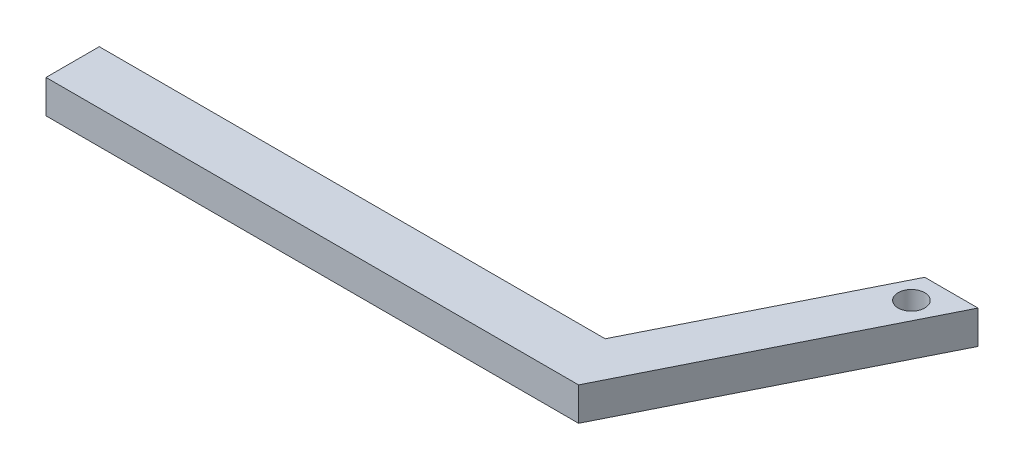
ISO-10303-21;
HEADER;
FILE_DESCRIPTION(('STEP AP214'),'2;1');
FILE_NAME('part.step','',(''),(''),'','','');
FILE_SCHEMA(('AUTOMOTIVE_DESIGN { 1 0 10303 214 1 1 1 1 }'));
ENDSEC;
DATA;
#1=APPLICATION_CONTEXT('core data for automotive mechanical design processes');
#2=APPLICATION_PROTOCOL_DEFINITION('international standard','automotive_design',2000,#1);
#3=PRODUCT_CONTEXT('',#1,'mechanical');
#4=PRODUCT('Part','Part','',(#3));
#5=PRODUCT_RELATED_PRODUCT_CATEGORY('part','',(#4));
#6=PRODUCT_DEFINITION_FORMATION('','',#4);
#7=PRODUCT_DEFINITION_CONTEXT('part definition',#1,'design');
#8=PRODUCT_DEFINITION('design','',#6,#7);
#9=PRODUCT_DEFINITION_SHAPE('','',#8);
#10=(LENGTH_UNIT() NAMED_UNIT(*) SI_UNIT(.MILLI.,.METRE.));
#11=(NAMED_UNIT(*) PLANE_ANGLE_UNIT() SI_UNIT($,.RADIAN.));
#12=(NAMED_UNIT(*) SI_UNIT($,.STERADIAN.) SOLID_ANGLE_UNIT());
#13=UNCERTAINTY_MEASURE_WITH_UNIT(LENGTH_MEASURE(1.E-05),#10,'distance_accuracy_value','');
#14=(GEOMETRIC_REPRESENTATION_CONTEXT(3) GLOBAL_UNCERTAINTY_ASSIGNED_CONTEXT((#13)) GLOBAL_UNIT_ASSIGNED_CONTEXT((#10,
#11,#12)) REPRESENTATION_CONTEXT('',''));
#15=CARTESIAN_POINT('',(0.,0.,0.));
#16=DIRECTION('',(0.,0.,1.));
#17=DIRECTION('',(1.,0.,0.));
#18=AXIS2_PLACEMENT_3D('',#15,#16,#17);
#19=CARTESIAN_POINT('',(-25.4,-1.5875,5.08));
#20=DIRECTION('',(1.,0.,0.));
#21=DIRECTION('',(0.,1.,0.));
#22=AXIS2_PLACEMENT_3D('',#19,#20,#21);
#23=PLANE('',#22);
#24=DIRECTION('',(0.,-1.,0.));
#25=VECTOR('',#24,1.);
#26=CARTESIAN_POINT('',(-25.4,-1.5875,0.));
#27=LINE('',#26,#25);
#28=CARTESIAN_POINT('',(-25.4,1.5875,0.));
#29=VERTEX_POINT('',#28);
#30=CARTESIAN_POINT('',(-25.4,-1.5875,0.));
#31=VERTEX_POINT('',#30);
#32=EDGE_CURVE('E81',#29,#31,#27,.T.);
#33=ORIENTED_EDGE('',*,*,#32,.T.);
#34=DIRECTION('',(0.,0.,-1.));
#35=VECTOR('',#34,1.);
#36=CARTESIAN_POINT('',(-25.4,-1.5875,5.08));
#37=LINE('',#36,#35);
#38=CARTESIAN_POINT('',(-25.4,-1.5875,5.08));
#39=VERTEX_POINT('',#38);
#40=EDGE_CURVE('E40',#39,#31,#37,.T.);
#41=ORIENTED_EDGE('',*,*,#40,.F.);
#42=DIRECTION('',(0.,-1.,0.));
#43=VECTOR('',#42,1.);
#44=CARTESIAN_POINT('',(-25.4,-1.5875,5.08));
#45=LINE('',#44,#43);
#46=CARTESIAN_POINT('',(-25.4,1.5875,5.08));
#47=VERTEX_POINT('',#46);
#48=EDGE_CURVE('E75',#47,#39,#45,.T.);
#49=ORIENTED_EDGE('',*,*,#48,.F.);
#50=DIRECTION('',(0.,0.,-1.));
#51=VECTOR('',#50,1.);
#52=CARTESIAN_POINT('',(-25.4,1.5875,5.08));
#53=LINE('',#52,#51);
#54=EDGE_CURVE('E70',#47,#29,#53,.T.);
#55=ORIENTED_EDGE('',*,*,#54,.T.);
#56=EDGE_LOOP('',(#33,#41,#49,#55));
#57=FACE_BOUND('',#56,.T.);
#58=ADVANCED_FACE('F33',(#57),#23,.F.);
#59=CARTESIAN_POINT('',(-25.4,-1.5875,5.08));
#60=DIRECTION('',(0.,1.,0.));
#61=DIRECTION('',(-1.,0.,0.));
#62=AXIS2_PLACEMENT_3D('',#59,#60,#61);
#63=PLANE('',#62);
#64=DIRECTION('',(1.,0.,0.));
#65=VECTOR('',#64,1.);
#66=CARTESIAN_POINT('',(-25.4,-1.5875,0.));
#67=LINE('',#66,#65);
#68=CARTESIAN_POINT('',(22.86,-1.5875,0.));
#69=VERTEX_POINT('',#68);
#70=EDGE_CURVE('E76',#31,#69,#67,.T.);
#71=ORIENTED_EDGE('',*,*,#70,.T.);
#72=DIRECTION('',(0.447213595499958,0.,-0.894427190999916));
#73=VECTOR('',#72,1.);
#74=CARTESIAN_POINT('',(33.02,-1.5875,-20.32));
#75=LINE('',#74,#73);
#76=CARTESIAN_POINT('',(33.02,-1.5875,-20.32));
#77=VERTEX_POINT('',#76);
#78=EDGE_CURVE('E139',#69,#77,#75,.T.);
#79=ORIENTED_EDGE('',*,*,#78,.T.);
#80=DIRECTION('',(1.,0.,0.));
#81=VECTOR('',#80,1.);
#82=CARTESIAN_POINT('',(38.1,-1.5875,-20.32));
#83=LINE('',#82,#81);
#84=CARTESIAN_POINT('',(38.1,-1.5875,-20.32));
#85=VERTEX_POINT('',#84);
#86=EDGE_CURVE('E137',#77,#85,#83,.T.);
#87=ORIENTED_EDGE('',*,*,#86,.T.);
#88=DIRECTION('',(-0.447213595499958,0.,0.894427190999916));
#89=VECTOR('',#88,1.);
#90=CARTESIAN_POINT('',(25.4,-1.5875,5.08));
#91=LINE('',#90,#89);
#92=CARTESIAN_POINT('',(25.4,-1.5875,5.08));
#93=VERTEX_POINT('',#92);
#94=EDGE_CURVE('E103',#85,#93,#91,.T.);
#95=ORIENTED_EDGE('',*,*,#94,.T.);
#96=DIRECTION('',(1.,0.,0.));
#97=VECTOR('',#96,1.);
#98=CARTESIAN_POINT('',(-25.4,-1.5875,5.08));
#99=LINE('',#98,#97);
#100=EDGE_CURVE('E99',#39,#93,#99,.T.);
#101=ORIENTED_EDGE('',*,*,#100,.F.);
#102=ORIENTED_EDGE('',*,*,#40,.T.);
#103=EDGE_LOOP('',(#71,#79,#87,#95,#101,#102));
#104=FACE_BOUND('',#103,.T.);
#105=CARTESIAN_POINT('',(34.29,-1.5875,-17.78));
#106=DIRECTION('',(0.,-1.,0.));
#107=DIRECTION('',(1.,0.,0.));
#108=AXIS2_PLACEMENT_3D('',#105,#106,#107);
#109=CIRCLE('',#108,1.27);
#110=CARTESIAN_POINT('',(35.56,-1.5875,-17.78));
#111=VERTEX_POINT('',#110);
#112=EDGE_CURVE('E141',#111,#111,#109,.T.);
#113=ORIENTED_EDGE('',*,*,#112,.F.);
#114=EDGE_LOOP('',(#113));
#115=FACE_BOUND('',#114,.T.);
#116=ADVANCED_FACE('F94',(#104,#115),#63,.F.);
#117=CARTESIAN_POINT('',(-25.4,1.5875,5.08));
#118=DIRECTION('',(0.,-1.,0.));
#119=DIRECTION('',(0.,0.,-1.));
#120=AXIS2_PLACEMENT_3D('',#117,#118,#119);
#121=PLANE('',#120);
#122=ORIENTED_EDGE('',*,*,#54,.F.);
#123=DIRECTION('',(-1.,0.,0.));
#124=VECTOR('',#123,1.);
#125=CARTESIAN_POINT('',(-25.4,1.5875,5.08));
#126=LINE('',#125,#124);
#127=CARTESIAN_POINT('',(25.4,1.5875,5.08));
#128=VERTEX_POINT('',#127);
#129=EDGE_CURVE('E55',#128,#47,#126,.T.);
#130=ORIENTED_EDGE('',*,*,#129,.F.);
#131=DIRECTION('',(0.447213595499958,0.,-0.894427190999916));
#132=VECTOR('',#131,1.);
#133=CARTESIAN_POINT('',(25.4,1.5875,5.08));
#134=LINE('',#133,#132);
#135=CARTESIAN_POINT('',(38.1,1.5875,-20.32));
#136=VERTEX_POINT('',#135);
#137=EDGE_CURVE('E116',#128,#136,#134,.T.);
#138=ORIENTED_EDGE('',*,*,#137,.T.);
#139=DIRECTION('',(-1.,0.,0.));
#140=VECTOR('',#139,1.);
#141=CARTESIAN_POINT('',(38.1,1.5875,-20.32));
#142=LINE('',#141,#140);
#143=CARTESIAN_POINT('',(33.02,1.5875,-20.32));
#144=VERTEX_POINT('',#143);
#145=EDGE_CURVE('E119',#136,#144,#142,.T.);
#146=ORIENTED_EDGE('',*,*,#145,.T.);
#147=DIRECTION('',(-0.447213595499958,0.,0.894427190999916));
#148=VECTOR('',#147,1.);
#149=CARTESIAN_POINT('',(33.02,1.5875,-20.32));
#150=LINE('',#149,#148);
#151=CARTESIAN_POINT('',(22.86,1.5875,0.));
#152=VERTEX_POINT('',#151);
#153=EDGE_CURVE('E47',#144,#152,#150,.T.);
#154=ORIENTED_EDGE('',*,*,#153,.T.);
#155=DIRECTION('',(-1.,0.,0.));
#156=VECTOR('',#155,1.);
#157=CARTESIAN_POINT('',(-25.4,1.5875,0.));
#158=LINE('',#157,#156);
#159=EDGE_CURVE('E66',#152,#29,#158,.T.);
#160=ORIENTED_EDGE('',*,*,#159,.T.);
#161=EDGE_LOOP('',(#122,#130,#138,#146,#154,#160));
#162=FACE_BOUND('',#161,.T.);
#163=CARTESIAN_POINT('',(34.29,1.5875,-17.78));
#164=DIRECTION('',(0.,-1.,0.));
#165=DIRECTION('',(0.,0.,-1.));
#166=AXIS2_PLACEMENT_3D('',#163,#164,#165);
#167=CIRCLE('',#166,1.27);
#168=CARTESIAN_POINT('',(34.29,1.5875,-19.05));
#169=VERTEX_POINT('',#168);
#170=EDGE_CURVE('E86',#169,#169,#167,.F.);
#171=ORIENTED_EDGE('',*,*,#170,.F.);
#172=EDGE_LOOP('',(#171));
#173=FACE_BOUND('',#172,.T.);
#174=ADVANCED_FACE('F68',(#162,#173),#121,.F.);
#175=CARTESIAN_POINT('',(0.,0.,5.08));
#176=DIRECTION('',(0.,0.,-1.));
#177=DIRECTION('',(-1.,0.,0.));
#178=AXIS2_PLACEMENT_3D('',#175,#176,#177);
#179=PLANE('',#178);
#180=ORIENTED_EDGE('',*,*,#100,.T.);
#181=DIRECTION('',(0.,1.,0.));
#182=VECTOR('',#181,1.);
#183=CARTESIAN_POINT('',(25.4,-1.5875,5.08));
#184=LINE('',#183,#182);
#185=EDGE_CURVE('E105',#93,#128,#184,.T.);
#186=ORIENTED_EDGE('',*,*,#185,.T.);
#187=ORIENTED_EDGE('',*,*,#129,.T.);
#188=ORIENTED_EDGE('',*,*,#48,.T.);
#189=EDGE_LOOP('',(#180,#186,#187,#188));
#190=FACE_BOUND('',#189,.T.);
#191=ADVANCED_FACE('F107',(#190),#179,.F.);
#192=CARTESIAN_POINT('',(0.,0.,0.));
#193=DIRECTION('',(0.,0.,-1.));
#194=DIRECTION('',(-1.,0.,0.));
#195=AXIS2_PLACEMENT_3D('',#192,#193,#194);
#196=PLANE('',#195);
#197=DIRECTION('',(0.,1.,0.));
#198=VECTOR('',#197,1.);
#199=CARTESIAN_POINT('',(22.86,0.,0.));
#200=LINE('',#199,#198);
#201=EDGE_CURVE('E11',#69,#152,#200,.T.);
#202=ORIENTED_EDGE('',*,*,#201,.F.);
#203=ORIENTED_EDGE('',*,*,#70,.F.);
#204=ORIENTED_EDGE('',*,*,#32,.F.);
#205=ORIENTED_EDGE('',*,*,#159,.F.);
#206=EDGE_LOOP('',(#202,#203,#204,#205));
#207=FACE_BOUND('',#206,.T.);
#208=ADVANCED_FACE('F83',(#207),#196,.T.);
#209=CARTESIAN_POINT('',(33.02,32.5921512639636,-20.32));
#210=DIRECTION('',(-0.894427190999916,0.,-0.447213595499958));
#211=DIRECTION('',(-0.447213595499958,0.,0.894427190999916));
#212=AXIS2_PLACEMENT_3D('',#209,#210,#211);
#213=PLANE('',#212);
#214=ORIENTED_EDGE('',*,*,#78,.F.);
#215=ORIENTED_EDGE('',*,*,#201,.T.);
#216=ORIENTED_EDGE('',*,*,#153,.F.);
#217=DIRECTION('',(0.,-1.,0.));
#218=VECTOR('',#217,1.);
#219=CARTESIAN_POINT('',(33.02,32.5921512639636,-20.32));
#220=LINE('',#219,#218);
#221=EDGE_CURVE('E131',#144,#77,#220,.T.);
#222=ORIENTED_EDGE('',*,*,#221,.T.);
#223=EDGE_LOOP('',(#214,#215,#216,#222));
#224=FACE_BOUND('',#223,.T.);
#225=ADVANCED_FACE('F156',(#224),#213,.T.);
#226=CARTESIAN_POINT('',(38.1,32.5921512639636,-20.32));
#227=DIRECTION('',(0.,0.,-1.));
#228=DIRECTION('',(-1.,0.,0.));
#229=AXIS2_PLACEMENT_3D('',#226,#227,#228);
#230=PLANE('',#229);
#231=ORIENTED_EDGE('',*,*,#145,.F.);
#232=DIRECTION('',(0.,-1.,0.));
#233=VECTOR('',#232,1.);
#234=CARTESIAN_POINT('',(38.1,32.5921512639636,-20.32));
#235=LINE('',#234,#233);
#236=EDGE_CURVE('E129',#136,#85,#235,.T.);
#237=ORIENTED_EDGE('',*,*,#236,.T.);
#238=ORIENTED_EDGE('',*,*,#86,.F.);
#239=ORIENTED_EDGE('',*,*,#221,.F.);
#240=EDGE_LOOP('',(#231,#237,#238,#239));
#241=FACE_BOUND('',#240,.T.);
#242=ADVANCED_FACE('F126',(#241),#230,.T.);
#243=CARTESIAN_POINT('',(25.4,32.5921512639636,5.08));
#244=DIRECTION('',(0.894427190999916,0.,0.447213595499958));
#245=DIRECTION('',(0.447213595499958,0.,-0.894427190999916));
#246=AXIS2_PLACEMENT_3D('',#243,#244,#245);
#247=PLANE('',#246);
#248=ORIENTED_EDGE('',*,*,#137,.F.);
#249=ORIENTED_EDGE('',*,*,#185,.F.);
#250=ORIENTED_EDGE('',*,*,#94,.F.);
#251=ORIENTED_EDGE('',*,*,#236,.F.);
#252=EDGE_LOOP('',(#248,#249,#250,#251));
#253=FACE_BOUND('',#252,.T.);
#254=ADVANCED_FACE('F133',(#253),#247,.T.);
#255=CARTESIAN_POINT('',(34.29,32.5921512639636,-17.78));
#256=DIRECTION('',(0.,-1.,0.));
#257=DIRECTION('',(1.,0.,0.));
#258=AXIS2_PLACEMENT_3D('',#255,#256,#257);
#259=CYLINDRICAL_SURFACE('',#258,1.27);
#260=ORIENTED_EDGE('',*,*,#170,.T.);
#261=EDGE_LOOP('',(#260));
#262=FACE_BOUND('',#261,.T.);
#263=ORIENTED_EDGE('',*,*,#112,.T.);
#264=EDGE_LOOP('',(#263));
#265=FACE_BOUND('',#264,.T.);
#266=ADVANCED_FACE('F146',(#262,#265),#259,.F.);
#267=CLOSED_SHELL('',(#58,#116,#174,#191,#208,#225,#242,#254,#266));
#268=MANIFOLD_SOLID_BREP('B2',#267);
#269=ADVANCED_BREP_SHAPE_REPRESENTATION('',(#18,#268),#14);
#270=SHAPE_DEFINITION_REPRESENTATION(#9,#269);
ENDSEC;
END-ISO-10303-21;
